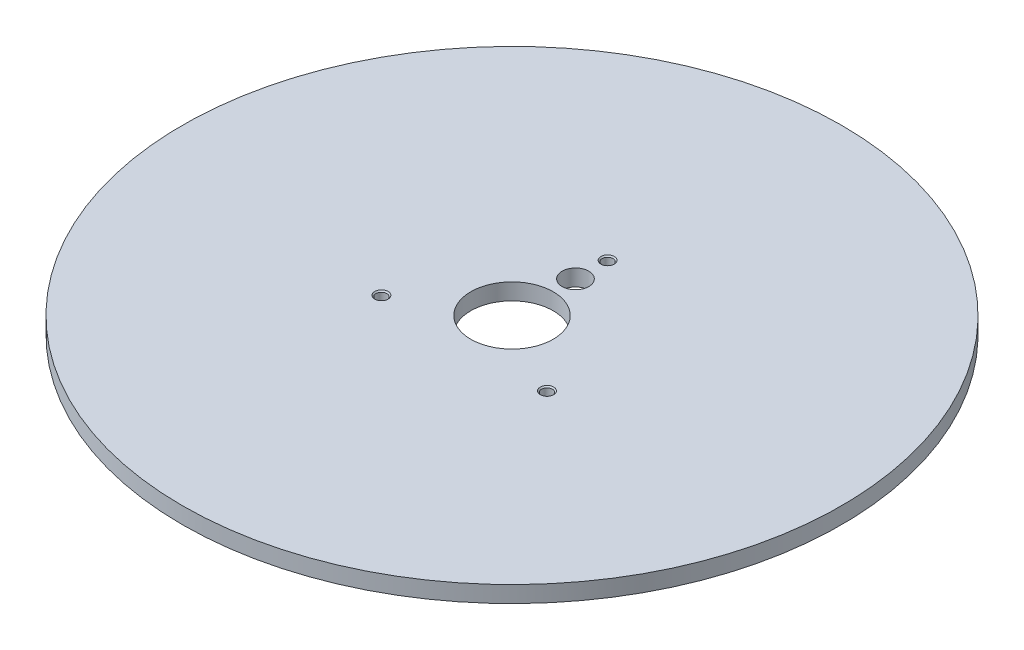
ISO-10303-21;
HEADER;
FILE_DESCRIPTION(('STEP AP214'),'2;1');
FILE_NAME('part.step','',(''),(''),'','','');
FILE_SCHEMA(('AUTOMOTIVE_DESIGN { 1 0 10303 214 1 1 1 1 }'));
ENDSEC;
DATA;
#1=APPLICATION_CONTEXT('core data for automotive mechanical design processes');
#2=APPLICATION_PROTOCOL_DEFINITION('international standard','automotive_design',2000,#1);
#3=PRODUCT_CONTEXT('',#1,'mechanical');
#4=PRODUCT('Part','Part','',(#3));
#5=PRODUCT_RELATED_PRODUCT_CATEGORY('part','',(#4));
#6=PRODUCT_DEFINITION_FORMATION('','',#4);
#7=PRODUCT_DEFINITION_CONTEXT('part definition',#1,'design');
#8=PRODUCT_DEFINITION('design','',#6,#7);
#9=PRODUCT_DEFINITION_SHAPE('','',#8);
#10=(LENGTH_UNIT() NAMED_UNIT(*) SI_UNIT(.MILLI.,.METRE.));
#11=(NAMED_UNIT(*) PLANE_ANGLE_UNIT() SI_UNIT($,.RADIAN.));
#12=(NAMED_UNIT(*) SI_UNIT($,.STERADIAN.) SOLID_ANGLE_UNIT());
#13=UNCERTAINTY_MEASURE_WITH_UNIT(LENGTH_MEASURE(1.E-05),#10,'distance_accuracy_value','');
#14=(GEOMETRIC_REPRESENTATION_CONTEXT(3) GLOBAL_UNCERTAINTY_ASSIGNED_CONTEXT((#13)) GLOBAL_UNIT_ASSIGNED_CONTEXT((#10,
#11,#12)) REPRESENTATION_CONTEXT('',''));
#15=CARTESIAN_POINT('',(0.,0.,0.));
#16=DIRECTION('',(0.,0.,1.));
#17=DIRECTION('',(1.,0.,0.));
#18=AXIS2_PLACEMENT_3D('',#15,#16,#17);
#19=CARTESIAN_POINT('',(0.,5.,0.));
#20=DIRECTION('',(0.,-1.,0.));
#21=DIRECTION('',(0.,0.,-1.));
#22=AXIS2_PLACEMENT_3D('',#19,#20,#21);
#23=CYLINDRICAL_SURFACE('',#22,100.);
#24=CARTESIAN_POINT('',(0.,5.,0.));
#25=DIRECTION('',(0.,1.,0.));
#26=DIRECTION('',(0.,0.,1.));
#27=AXIS2_PLACEMENT_3D('',#24,#25,#26);
#28=CIRCLE('',#27,100.);
#29=CARTESIAN_POINT('',(0.,5.,100.));
#30=VERTEX_POINT('',#29);
#31=EDGE_CURVE('E10',#30,#30,#28,.T.);
#32=ORIENTED_EDGE('',*,*,#31,.F.);
#33=EDGE_LOOP('',(#32));
#34=FACE_BOUND('',#33,.T.);
#35=CARTESIAN_POINT('',(0.,0.,0.));
#36=DIRECTION('',(0.,1.,0.));
#37=DIRECTION('',(0.,0.,1.));
#38=AXIS2_PLACEMENT_3D('',#35,#36,#37);
#39=CIRCLE('',#38,100.);
#40=CARTESIAN_POINT('',(0.,0.,100.));
#41=VERTEX_POINT('',#40);
#42=EDGE_CURVE('E42',#41,#41,#39,.T.);
#43=ORIENTED_EDGE('',*,*,#42,.T.);
#44=EDGE_LOOP('',(#43));
#45=FACE_BOUND('',#44,.T.);
#46=ADVANCED_FACE('F39',(#34,#45),#23,.T.);
#47=CARTESIAN_POINT('',(0.,5.,0.));
#48=DIRECTION('',(0.,1.,0.));
#49=DIRECTION('',(0.,0.,1.));
#50=AXIS2_PLACEMENT_3D('',#47,#48,#49);
#51=PLANE('',#50);
#52=CARTESIAN_POINT('',(0.,5.,-29.));
#53=DIRECTION('',(0.,1.,0.));
#54=DIRECTION('',(0.,0.,1.));
#55=AXIS2_PLACEMENT_3D('',#52,#53,#54);
#56=CIRCLE('',#55,2.025);
#57=CARTESIAN_POINT('',(0.,5.,-26.975));
#58=VERTEX_POINT('',#57);
#59=EDGE_CURVE('E86',#58,#58,#56,.T.);
#60=ORIENTED_EDGE('',*,*,#59,.F.);
#61=EDGE_LOOP('',(#60));
#62=FACE_BOUND('',#61,.T.);
#63=CARTESIAN_POINT('',(-25.1147367097489,5.,14.4999999999998));
#64=DIRECTION('',(0.,1.,0.));
#65=DIRECTION('',(0.,0.,1.));
#66=AXIS2_PLACEMENT_3D('',#63,#64,#65);
#67=CIRCLE('',#66,2.025);
#68=CARTESIAN_POINT('',(-25.1147367097489,5.,16.5249999999998));
#69=VERTEX_POINT('',#68);
#70=EDGE_CURVE('E77',#69,#69,#67,.T.);
#71=ORIENTED_EDGE('',*,*,#70,.F.);
#72=EDGE_LOOP('',(#71));
#73=FACE_BOUND('',#72,.T.);
#74=CARTESIAN_POINT('',(25.1147367097487,5.,14.5000000000001));
#75=DIRECTION('',(0.,1.,0.));
#76=DIRECTION('',(0.,0.,1.));
#77=AXIS2_PLACEMENT_3D('',#74,#75,#76);
#78=CIRCLE('',#77,2.025);
#79=CARTESIAN_POINT('',(25.1147367097487,5.,16.5250000000001));
#80=VERTEX_POINT('',#79);
#81=EDGE_CURVE('E68',#80,#80,#78,.T.);
#82=ORIENTED_EDGE('',*,*,#81,.F.);
#83=EDGE_LOOP('',(#82));
#84=FACE_BOUND('',#83,.T.);
#85=CARTESIAN_POINT('',(0.,5.,0.));
#86=DIRECTION('',(0.,1.,0.));
#87=DIRECTION('',(0.,0.,1.));
#88=AXIS2_PLACEMENT_3D('',#85,#86,#87);
#89=CIRCLE('',#88,12.5);
#90=CARTESIAN_POINT('',(0.,5.,12.5));
#91=VERTEX_POINT('',#90);
#92=EDGE_CURVE('E54',#91,#91,#89,.T.);
#93=ORIENTED_EDGE('',*,*,#92,.F.);
#94=EDGE_LOOP('',(#93));
#95=FACE_BOUND('',#94,.T.);
#96=CARTESIAN_POINT('',(0.,5.,-19.25));
#97=DIRECTION('',(0.,1.,0.));
#98=DIRECTION('',(0.,0.,1.));
#99=AXIS2_PLACEMENT_3D('',#96,#97,#98);
#100=CIRCLE('',#99,4.05);
#101=CARTESIAN_POINT('',(0.,5.,-15.2));
#102=VERTEX_POINT('',#101);
#103=EDGE_CURVE('E51',#102,#102,#100,.T.);
#104=ORIENTED_EDGE('',*,*,#103,.F.);
#105=EDGE_LOOP('',(#104));
#106=FACE_BOUND('',#105,.T.);
#107=ORIENTED_EDGE('',*,*,#31,.T.);
#108=EDGE_LOOP('',(#107));
#109=FACE_BOUND('',#108,.T.);
#110=ADVANCED_FACE('F92',(#62,#73,#84,#95,#106,#109),#51,.T.);
#111=CARTESIAN_POINT('',(0.,0.,0.));
#112=DIRECTION('',(0.,1.,0.));
#113=DIRECTION('',(0.,0.,1.));
#114=AXIS2_PLACEMENT_3D('',#111,#112,#113);
#115=PLANE('',#114);
#116=CARTESIAN_POINT('',(0.,0.,-29.));
#117=DIRECTION('',(0.,1.,0.));
#118=DIRECTION('',(0.,0.,1.));
#119=AXIS2_PLACEMENT_3D('',#116,#117,#118);
#120=CIRCLE('',#119,1.65);
#121=CARTESIAN_POINT('',(0.,0.,-27.35));
#122=VERTEX_POINT('',#121);
#123=EDGE_CURVE('E80',#122,#122,#120,.T.);
#124=ORIENTED_EDGE('',*,*,#123,.T.);
#125=EDGE_LOOP('',(#124));
#126=FACE_BOUND('',#125,.T.);
#127=CARTESIAN_POINT('',(-25.1147367097489,0.,14.4999999999998));
#128=DIRECTION('',(0.,1.,0.));
#129=DIRECTION('',(0.,0.,1.));
#130=AXIS2_PLACEMENT_3D('',#127,#128,#129);
#131=CIRCLE('',#130,1.65);
#132=CARTESIAN_POINT('',(-25.1147367097489,0.,16.1499999999998));
#133=VERTEX_POINT('',#132);
#134=EDGE_CURVE('E71',#133,#133,#131,.T.);
#135=ORIENTED_EDGE('',*,*,#134,.T.);
#136=EDGE_LOOP('',(#135));
#137=FACE_BOUND('',#136,.T.);
#138=CARTESIAN_POINT('',(25.1147367097487,0.,14.5000000000001));
#139=DIRECTION('',(0.,1.,0.));
#140=DIRECTION('',(0.,0.,1.));
#141=AXIS2_PLACEMENT_3D('',#138,#139,#140);
#142=CIRCLE('',#141,1.65);
#143=CARTESIAN_POINT('',(25.1147367097487,0.,16.1500000000001));
#144=VERTEX_POINT('',#143);
#145=EDGE_CURVE('E58',#144,#144,#142,.T.);
#146=ORIENTED_EDGE('',*,*,#145,.T.);
#147=EDGE_LOOP('',(#146));
#148=FACE_BOUND('',#147,.T.);
#149=CARTESIAN_POINT('',(0.,0.,0.));
#150=DIRECTION('',(0.,1.,0.));
#151=DIRECTION('',(0.,0.,1.));
#152=AXIS2_PLACEMENT_3D('',#149,#150,#151);
#153=CIRCLE('',#152,12.5);
#154=CARTESIAN_POINT('',(0.,0.,12.5));
#155=VERTEX_POINT('',#154);
#156=EDGE_CURVE('E49',#155,#155,#153,.F.);
#157=ORIENTED_EDGE('',*,*,#156,.F.);
#158=EDGE_LOOP('',(#157));
#159=FACE_BOUND('',#158,.T.);
#160=CARTESIAN_POINT('',(0.,0.,-19.25));
#161=DIRECTION('',(0.,1.,0.));
#162=DIRECTION('',(0.,0.,1.));
#163=AXIS2_PLACEMENT_3D('',#160,#161,#162);
#164=CIRCLE('',#163,4.05);
#165=CARTESIAN_POINT('',(0.,0.,-15.2));
#166=VERTEX_POINT('',#165);
#167=EDGE_CURVE('E55',#166,#166,#164,.F.);
#168=ORIENTED_EDGE('',*,*,#167,.F.);
#169=EDGE_LOOP('',(#168));
#170=FACE_BOUND('',#169,.T.);
#171=ORIENTED_EDGE('',*,*,#42,.F.);
#172=EDGE_LOOP('',(#171));
#173=FACE_BOUND('',#172,.T.);
#174=ADVANCED_FACE('F95',(#126,#137,#148,#159,#170,#173),#115,.F.);
#175=CARTESIAN_POINT('',(0.,-0.00100000000000013,-19.25));
#176=DIRECTION('',(0.,1.,0.));
#177=DIRECTION('',(0.,0.,1.));
#178=AXIS2_PLACEMENT_3D('',#175,#176,#177);
#179=CYLINDRICAL_SURFACE('',#178,4.05);
#180=ORIENTED_EDGE('',*,*,#103,.T.);
#181=EDGE_LOOP('',(#180));
#182=FACE_BOUND('',#181,.T.);
#183=ORIENTED_EDGE('',*,*,#167,.T.);
#184=EDGE_LOOP('',(#183));
#185=FACE_BOUND('',#184,.T.);
#186=ADVANCED_FACE('F105',(#182,#185),#179,.F.);
#187=CARTESIAN_POINT('',(0.,-0.00100000000000013,0.));
#188=DIRECTION('',(0.,1.,0.));
#189=DIRECTION('',(0.,0.,1.));
#190=AXIS2_PLACEMENT_3D('',#187,#188,#189);
#191=CYLINDRICAL_SURFACE('',#190,12.5);
#192=ORIENTED_EDGE('',*,*,#92,.T.);
#193=EDGE_LOOP('',(#192));
#194=FACE_BOUND('',#193,.T.);
#195=ORIENTED_EDGE('',*,*,#156,.T.);
#196=EDGE_LOOP('',(#195));
#197=FACE_BOUND('',#196,.T.);
#198=ADVANCED_FACE('F108',(#194,#197),#191,.F.);
#199=CARTESIAN_POINT('',(25.1147367097487,5.,14.5000000000001));
#200=DIRECTION('',(0.,1.,0.));
#201=DIRECTION('',(0.,0.,1.));
#202=AXIS2_PLACEMENT_3D('',#199,#200,#201);
#203=CYLINDRICAL_SURFACE('',#202,1.65);
#204=ORIENTED_EDGE('',*,*,#145,.F.);
#205=EDGE_LOOP('',(#204));
#206=FACE_BOUND('',#205,.T.);
#207=CARTESIAN_POINT('',(25.1147367097487,4.625,14.5000000000001));
#208=DIRECTION('',(0.,1.,0.));
#209=DIRECTION('',(0.,0.,1.));
#210=AXIS2_PLACEMENT_3D('',#207,#208,#209);
#211=CIRCLE('',#210,1.65);
#212=CARTESIAN_POINT('',(25.1147367097487,4.625,16.1500000000001));
#213=VERTEX_POINT('',#212);
#214=EDGE_CURVE('E65',#213,#213,#211,.T.);
#215=ORIENTED_EDGE('',*,*,#214,.T.);
#216=EDGE_LOOP('',(#215));
#217=FACE_BOUND('',#216,.T.);
#218=ADVANCED_FACE('F134',(#206,#217),#203,.F.);
#219=CARTESIAN_POINT('',(25.1147367097487,5.,14.5000000000001));
#220=DIRECTION('',(0.,1.,0.));
#221=DIRECTION('',(0.,0.,1.));
#222=AXIS2_PLACEMENT_3D('',#219,#220,#221);
#223=CONICAL_SURFACE('',#222,2.025,0.785398163397448);
#224=ORIENTED_EDGE('',*,*,#214,.F.);
#225=EDGE_LOOP('',(#224));
#226=FACE_BOUND('',#225,.T.);
#227=ORIENTED_EDGE('',*,*,#81,.T.);
#228=EDGE_LOOP('',(#227));
#229=FACE_BOUND('',#228,.T.);
#230=ADVANCED_FACE('F153',(#226,#229),#223,.F.);
#231=CARTESIAN_POINT('',(-25.1147367097489,5.,14.4999999999998));
#232=DIRECTION('',(0.,1.,0.));
#233=DIRECTION('',(0.,0.,1.));
#234=AXIS2_PLACEMENT_3D('',#231,#232,#233);
#235=CYLINDRICAL_SURFACE('',#234,1.65);
#236=ORIENTED_EDGE('',*,*,#134,.F.);
#237=EDGE_LOOP('',(#236));
#238=FACE_BOUND('',#237,.T.);
#239=CARTESIAN_POINT('',(-25.1147367097489,4.625,14.4999999999998));
#240=DIRECTION('',(0.,1.,0.));
#241=DIRECTION('',(0.,0.,1.));
#242=AXIS2_PLACEMENT_3D('',#239,#240,#241);
#243=CIRCLE('',#242,1.65);
#244=CARTESIAN_POINT('',(-25.1147367097489,4.625,16.1499999999998));
#245=VERTEX_POINT('',#244);
#246=EDGE_CURVE('E74',#245,#245,#243,.T.);
#247=ORIENTED_EDGE('',*,*,#246,.T.);
#248=EDGE_LOOP('',(#247));
#249=FACE_BOUND('',#248,.T.);
#250=ADVANCED_FACE('F164',(#238,#249),#235,.F.);
#251=CARTESIAN_POINT('',(-25.1147367097489,5.,14.4999999999998));
#252=DIRECTION('',(0.,1.,0.));
#253=DIRECTION('',(0.,0.,1.));
#254=AXIS2_PLACEMENT_3D('',#251,#252,#253);
#255=CONICAL_SURFACE('',#254,2.025,0.785398163397448);
#256=ORIENTED_EDGE('',*,*,#246,.F.);
#257=EDGE_LOOP('',(#256));
#258=FACE_BOUND('',#257,.T.);
#259=ORIENTED_EDGE('',*,*,#70,.T.);
#260=EDGE_LOOP('',(#259));
#261=FACE_BOUND('',#260,.T.);
#262=ADVANCED_FACE('F173',(#258,#261),#255,.F.);
#263=CARTESIAN_POINT('',(0.,5.,-29.));
#264=DIRECTION('',(0.,1.,0.));
#265=DIRECTION('',(0.,0.,1.));
#266=AXIS2_PLACEMENT_3D('',#263,#264,#265);
#267=CYLINDRICAL_SURFACE('',#266,1.65);
#268=ORIENTED_EDGE('',*,*,#123,.F.);
#269=EDGE_LOOP('',(#268));
#270=FACE_BOUND('',#269,.T.);
#271=CARTESIAN_POINT('',(0.,4.625,-29.));
#272=DIRECTION('',(0.,1.,0.));
#273=DIRECTION('',(0.,0.,1.));
#274=AXIS2_PLACEMENT_3D('',#271,#272,#273);
#275=CIRCLE('',#274,1.65);
#276=CARTESIAN_POINT('',(0.,4.625,-27.35));
#277=VERTEX_POINT('',#276);
#278=EDGE_CURVE('E83',#277,#277,#275,.T.);
#279=ORIENTED_EDGE('',*,*,#278,.T.);
#280=EDGE_LOOP('',(#279));
#281=FACE_BOUND('',#280,.T.);
#282=ADVANCED_FACE('F184',(#270,#281),#267,.F.);
#283=CARTESIAN_POINT('',(0.,5.,-29.));
#284=DIRECTION('',(0.,1.,0.));
#285=DIRECTION('',(0.,0.,1.));
#286=AXIS2_PLACEMENT_3D('',#283,#284,#285);
#287=CONICAL_SURFACE('',#286,2.025,0.785398163397449);
#288=ORIENTED_EDGE('',*,*,#278,.F.);
#289=EDGE_LOOP('',(#288));
#290=FACE_BOUND('',#289,.T.);
#291=ORIENTED_EDGE('',*,*,#59,.T.);
#292=EDGE_LOOP('',(#291));
#293=FACE_BOUND('',#292,.T.);
#294=ADVANCED_FACE('F90',(#290,#293),#287,.F.);
#295=CLOSED_SHELL('',(#46,#110,#174,#186,#198,#218,#230,#250,#262,#282,#294));
#296=MANIFOLD_SOLID_BREP('B2',#295);
#297=ADVANCED_BREP_SHAPE_REPRESENTATION('',(#18,#296),#14);
#298=SHAPE_DEFINITION_REPRESENTATION(#9,#297);
ENDSEC;
END-ISO-10303-21;
